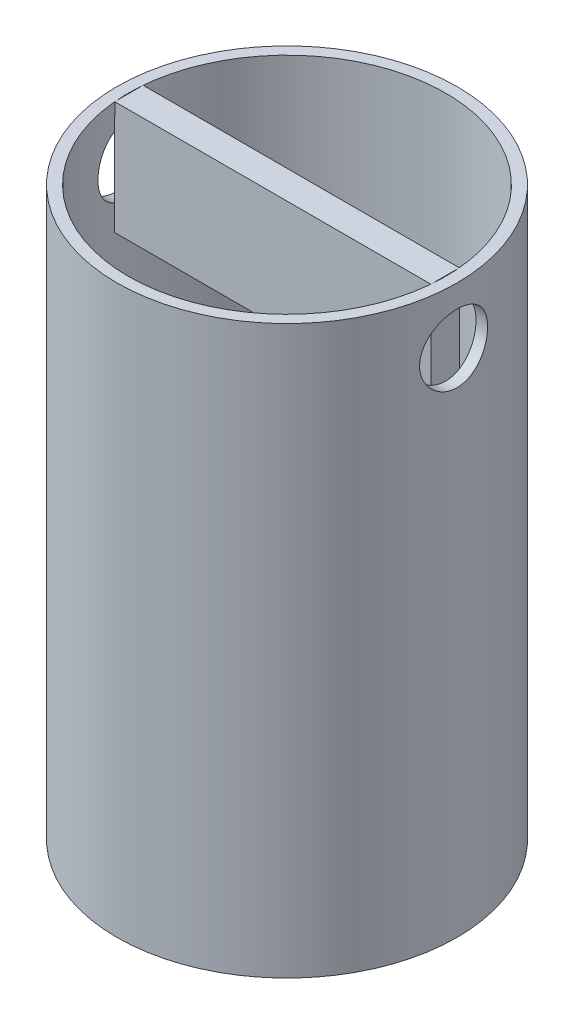
ISO-10303-21;
HEADER;
FILE_DESCRIPTION(('STEP AP214'),'2;1');
FILE_NAME('part.step','',(''),(''),'','','');
FILE_SCHEMA(('AUTOMOTIVE_DESIGN { 1 0 10303 214 1 1 1 1 }'));
ENDSEC;
DATA;
#1=APPLICATION_CONTEXT('core data for automotive mechanical design processes');
#2=APPLICATION_PROTOCOL_DEFINITION('international standard','automotive_design',2000,#1);
#3=PRODUCT_CONTEXT('',#1,'mechanical');
#4=PRODUCT('Part','Part','',(#3));
#5=PRODUCT_RELATED_PRODUCT_CATEGORY('part','',(#4));
#6=PRODUCT_DEFINITION_FORMATION('','',#4);
#7=PRODUCT_DEFINITION_CONTEXT('part definition',#1,'design');
#8=PRODUCT_DEFINITION('design','',#6,#7);
#9=PRODUCT_DEFINITION_SHAPE('','',#8);
#10=(LENGTH_UNIT() NAMED_UNIT(*) SI_UNIT(.MILLI.,.METRE.));
#11=(NAMED_UNIT(*) PLANE_ANGLE_UNIT() SI_UNIT($,.RADIAN.));
#12=(NAMED_UNIT(*) SI_UNIT($,.STERADIAN.) SOLID_ANGLE_UNIT());
#13=UNCERTAINTY_MEASURE_WITH_UNIT(LENGTH_MEASURE(1.E-05),#10,'distance_accuracy_value','');
#14=(GEOMETRIC_REPRESENTATION_CONTEXT(3) GLOBAL_UNCERTAINTY_ASSIGNED_CONTEXT((#13)) GLOBAL_UNIT_ASSIGNED_CONTEXT((#10,
#11,#12)) REPRESENTATION_CONTEXT('',''));
#15=CARTESIAN_POINT('',(0.,0.,0.));
#16=DIRECTION('',(0.,0.,1.));
#17=DIRECTION('',(1.,0.,0.));
#18=AXIS2_PLACEMENT_3D('',#15,#16,#17);
#19=CARTESIAN_POINT('',(-13.9438942457231,40.,-1.25212350193235));
#20=DIRECTION('',(-1.,0.,0.));
#21=DIRECTION('',(0.,0.,1.));
#22=AXIS2_PLACEMENT_3D('',#19,#20,#21);
#23=PLANE('',#22);
#24=DIRECTION('',(0.,0.,1.));
#25=VECTOR('',#24,1.);
#26=CARTESIAN_POINT('',(-13.9438942457231,50.,-1.25212350193235));
#27=LINE('',#26,#25);
#28=CARTESIAN_POINT('',(-13.9438942457231,50.,-1.25212350193235));
#29=VERTEX_POINT('',#28);
#30=CARTESIAN_POINT('',(-13.9438942457231,50.,1.25212350193235));
#31=VERTEX_POINT('',#30);
#32=EDGE_CURVE('E113',#29,#31,#27,.T.);
#33=ORIENTED_EDGE('',*,*,#32,.F.);
#34=DIRECTION('',(0.,1.,0.));
#35=VECTOR('',#34,1.);
#36=CARTESIAN_POINT('',(-13.9438942457231,40.,-1.25212350193235));
#37=LINE('',#36,#35);
#38=CARTESIAN_POINT('',(-13.9438942457231,40.,-1.25212350193235));
#39=VERTEX_POINT('',#38);
#40=EDGE_CURVE('E12',#39,#29,#37,.T.);
#41=ORIENTED_EDGE('',*,*,#40,.F.);
#42=DIRECTION('',(0.,0.,1.));
#43=VECTOR('',#42,1.);
#44=CARTESIAN_POINT('',(-13.9438942457231,40.,-1.25212350193235));
#45=LINE('',#44,#43);
#46=CARTESIAN_POINT('',(-13.9438942457231,40.,1.25212350193235));
#47=VERTEX_POINT('',#46);
#48=EDGE_CURVE('E107',#39,#47,#45,.T.);
#49=ORIENTED_EDGE('',*,*,#48,.T.);
#50=DIRECTION('',(0.,1.,0.));
#51=VECTOR('',#50,1.);
#52=CARTESIAN_POINT('',(-13.9438942457231,40.,1.25212350193235));
#53=LINE('',#52,#51);
#54=EDGE_CURVE('E52',#47,#31,#53,.T.);
#55=ORIENTED_EDGE('',*,*,#54,.T.);
#56=EDGE_LOOP('',(#33,#41,#49,#55));
#57=FACE_BOUND('',#56,.T.);
#58=ADVANCED_FACE('F49',(#57),#23,.T.);
#59=CARTESIAN_POINT('',(13.9438942457231,40.,-1.25212350193235));
#60=DIRECTION('',(0.,0.,-1.));
#61=DIRECTION('',(-1.,0.,0.));
#62=AXIS2_PLACEMENT_3D('',#59,#60,#61);
#63=PLANE('',#62);
#64=DIRECTION('',(-1.,0.,0.));
#65=VECTOR('',#64,1.);
#66=CARTESIAN_POINT('',(13.9438942457231,50.,-1.25212350193235));
#67=LINE('',#66,#65);
#68=CARTESIAN_POINT('',(13.9438942457231,50.,-1.25212350193235));
#69=VERTEX_POINT('',#68);
#70=EDGE_CURVE('E109',#69,#29,#67,.T.);
#71=ORIENTED_EDGE('',*,*,#70,.F.);
#72=DIRECTION('',(0.,1.,0.));
#73=VECTOR('',#72,1.);
#74=CARTESIAN_POINT('',(13.9438942457231,40.,-1.25212350193235));
#75=LINE('',#74,#73);
#76=CARTESIAN_POINT('',(13.9438942457231,40.,-1.25212350193235));
#77=VERTEX_POINT('',#76);
#78=EDGE_CURVE('E58',#77,#69,#75,.T.);
#79=ORIENTED_EDGE('',*,*,#78,.F.);
#80=DIRECTION('',(-1.,0.,0.));
#81=VECTOR('',#80,1.);
#82=CARTESIAN_POINT('',(13.9438942457231,40.,-1.25212350193235));
#83=LINE('',#82,#81);
#84=EDGE_CURVE('E104',#77,#39,#83,.T.);
#85=ORIENTED_EDGE('',*,*,#84,.T.);
#86=ORIENTED_EDGE('',*,*,#40,.T.);
#87=EDGE_LOOP('',(#71,#79,#85,#86));
#88=FACE_BOUND('',#87,.T.);
#89=ADVANCED_FACE('F123',(#88),#63,.T.);
#90=CARTESIAN_POINT('',(13.9438942457231,40.,-1.25212350193235));
#91=DIRECTION('',(1.,0.,0.));
#92=DIRECTION('',(0.,0.,-1.));
#93=AXIS2_PLACEMENT_3D('',#90,#91,#92);
#94=PLANE('',#93);
#95=DIRECTION('',(0.,0.,-1.));
#96=VECTOR('',#95,1.);
#97=CARTESIAN_POINT('',(13.9438942457231,50.,-1.25212350193235));
#98=LINE('',#97,#96);
#99=CARTESIAN_POINT('',(13.9438942457231,50.,1.25212350193235));
#100=VERTEX_POINT('',#99);
#101=EDGE_CURVE('E99',#100,#69,#98,.T.);
#102=ORIENTED_EDGE('',*,*,#101,.F.);
#103=DIRECTION('',(0.,1.,0.));
#104=VECTOR('',#103,1.);
#105=CARTESIAN_POINT('',(13.9438942457231,40.,1.25212350193235));
#106=LINE('',#105,#104);
#107=CARTESIAN_POINT('',(13.9438942457231,40.,1.25212350193235));
#108=VERTEX_POINT('',#107);
#109=EDGE_CURVE('E94',#108,#100,#106,.T.);
#110=ORIENTED_EDGE('',*,*,#109,.F.);
#111=DIRECTION('',(0.,0.,-1.));
#112=VECTOR('',#111,1.);
#113=CARTESIAN_POINT('',(13.9438942457231,40.,-1.25212350193235));
#114=LINE('',#113,#112);
#115=EDGE_CURVE('E97',#108,#77,#114,.T.);
#116=ORIENTED_EDGE('',*,*,#115,.T.);
#117=ORIENTED_EDGE('',*,*,#78,.T.);
#118=EDGE_LOOP('',(#102,#110,#116,#117));
#119=FACE_BOUND('',#118,.T.);
#120=ADVANCED_FACE('F96',(#119),#94,.T.);
#121=CARTESIAN_POINT('',(13.9438942457231,40.,1.25212350193235));
#122=DIRECTION('',(0.,0.,1.));
#123=DIRECTION('',(1.,0.,0.));
#124=AXIS2_PLACEMENT_3D('',#121,#122,#123);
#125=PLANE('',#124);
#126=DIRECTION('',(1.,0.,0.));
#127=VECTOR('',#126,1.);
#128=CARTESIAN_POINT('',(13.9438942457231,50.,1.25212350193235));
#129=LINE('',#128,#127);
#130=EDGE_CURVE('E116',#31,#100,#129,.T.);
#131=ORIENTED_EDGE('',*,*,#130,.F.);
#132=ORIENTED_EDGE('',*,*,#54,.F.);
#133=DIRECTION('',(1.,0.,0.));
#134=VECTOR('',#133,1.);
#135=CARTESIAN_POINT('',(13.9438942457231,40.,1.25212350193235));
#136=LINE('',#135,#134);
#137=EDGE_CURVE('E103',#47,#108,#136,.T.);
#138=ORIENTED_EDGE('',*,*,#137,.T.);
#139=ORIENTED_EDGE('',*,*,#109,.T.);
#140=EDGE_LOOP('',(#131,#132,#138,#139));
#141=FACE_BOUND('',#140,.T.);
#142=ADVANCED_FACE('F106',(#141),#125,.T.);
#143=CARTESIAN_POINT('',(0.,40.,0.));
#144=DIRECTION('',(0.,-1.,0.));
#145=DIRECTION('',(0.,0.,-1.));
#146=AXIS2_PLACEMENT_3D('',#143,#144,#145);
#147=PLANE('',#146);
#148=ORIENTED_EDGE('',*,*,#48,.F.);
#149=ORIENTED_EDGE('',*,*,#84,.F.);
#150=ORIENTED_EDGE('',*,*,#115,.F.);
#151=ORIENTED_EDGE('',*,*,#137,.F.);
#152=EDGE_LOOP('',(#148,#149,#150,#151));
#153=FACE_BOUND('',#152,.T.);
#154=ADVANCED_FACE('F102',(#153),#147,.T.);
#155=CARTESIAN_POINT('',(0.,50.,0.));
#156=DIRECTION('',(0.,-1.,0.));
#157=DIRECTION('',(0.,0.,-1.));
#158=AXIS2_PLACEMENT_3D('',#155,#156,#157);
#159=PLANE('',#158);
#160=ORIENTED_EDGE('',*,*,#32,.T.);
#161=ORIENTED_EDGE('',*,*,#130,.T.);
#162=ORIENTED_EDGE('',*,*,#101,.T.);
#163=ORIENTED_EDGE('',*,*,#70,.T.);
#164=EDGE_LOOP('',(#160,#161,#162,#163));
#165=FACE_BOUND('',#164,.T.);
#166=ADVANCED_FACE('F122',(#165),#159,.F.);
#167=CLOSED_SHELL('',(#58,#89,#120,#142,#154,#166));
#168=MANIFOLD_SOLID_BREP('B2',#167);
#169=CARTESIAN_POINT('',(0.,50.,0.));
#170=DIRECTION('',(0.,1.,0.));
#171=DIRECTION('',(0.,0.,1.));
#172=AXIS2_PLACEMENT_3D('',#169,#170,#171);
#173=PLANE('',#172);
#174=CARTESIAN_POINT('',(0.,50.,0.));
#175=DIRECTION('',(0.,1.,0.));
#176=DIRECTION('',(0.,0.,1.));
#177=AXIS2_PLACEMENT_3D('',#174,#175,#176);
#178=CIRCLE('',#177,15.);
#179=CARTESIAN_POINT('',(0.,50.,15.));
#180=VERTEX_POINT('',#179);
#181=EDGE_CURVE('E48',#180,#180,#178,.T.);
#182=ORIENTED_EDGE('',*,*,#181,.T.);
#183=EDGE_LOOP('',(#182));
#184=FACE_BOUND('',#183,.T.);
#185=CARTESIAN_POINT('',(0.,50.,0.));
#186=DIRECTION('',(0.,1.,0.));
#187=DIRECTION('',(0.,0.,1.));
#188=AXIS2_PLACEMENT_3D('',#185,#186,#187);
#189=CIRCLE('',#188,14.);
#190=CARTESIAN_POINT('',(0.,50.,14.));
#191=VERTEX_POINT('',#190);
#192=EDGE_CURVE('E192',#191,#191,#189,.T.);
#193=ORIENTED_EDGE('',*,*,#192,.F.);
#194=EDGE_LOOP('',(#193));
#195=FACE_BOUND('',#194,.T.);
#196=ADVANCED_FACE('F173',(#184,#195),#173,.T.);
#197=CARTESIAN_POINT('',(0.,0.,0.));
#198=DIRECTION('',(0.,1.,0.));
#199=DIRECTION('',(0.,0.,1.));
#200=AXIS2_PLACEMENT_3D('',#197,#198,#199);
#201=PLANE('',#200);
#202=CARTESIAN_POINT('',(0.,0.,0.));
#203=DIRECTION('',(0.,1.,0.));
#204=DIRECTION('',(0.,0.,1.));
#205=AXIS2_PLACEMENT_3D('',#202,#203,#204);
#206=CIRCLE('',#205,15.);
#207=CARTESIAN_POINT('',(0.,0.,15.));
#208=VERTEX_POINT('',#207);
#209=EDGE_CURVE('E187',#208,#208,#206,.T.);
#210=ORIENTED_EDGE('',*,*,#209,.F.);
#211=EDGE_LOOP('',(#210));
#212=FACE_BOUND('',#211,.T.);
#213=CARTESIAN_POINT('',(0.,0.,0.));
#214=DIRECTION('',(0.,1.,0.));
#215=DIRECTION('',(0.,0.,1.));
#216=AXIS2_PLACEMENT_3D('',#213,#214,#215);
#217=CIRCLE('',#216,14.);
#218=CARTESIAN_POINT('',(0.,0.,14.));
#219=VERTEX_POINT('',#218);
#220=EDGE_CURVE('E195',#219,#219,#217,.T.);
#221=ORIENTED_EDGE('',*,*,#220,.T.);
#222=EDGE_LOOP('',(#221));
#223=FACE_BOUND('',#222,.T.);
#224=ADVANCED_FACE('F231',(#212,#223),#201,.F.);
#225=CARTESIAN_POINT('',(0.,50.,0.));
#226=DIRECTION('',(0.,-1.,0.));
#227=DIRECTION('',(0.,0.,-1.));
#228=AXIS2_PLACEMENT_3D('',#225,#226,#227);
#229=CYLINDRICAL_SURFACE('',#228,15.);
#230=CARTESIAN_POINT('',(-15.,42.,0.));
#231=CARTESIAN_POINT('',(-14.9999969274261,42.000006133495,-0.1667307203779));
#232=CARTESIAN_POINT('',(-14.9971915553469,42.0139465289029,-0.333538980604568));
#233=CARTESIAN_POINT('',(-14.9862709686969,42.0692955003457,-0.662440523067059));
#234=CARTESIAN_POINT('',(-14.9781515358056,42.1107258984045,-0.824529952624068));
#235=CARTESIAN_POINT('',(-14.9575094783486,42.2197238208624,-1.13919091578994));
#236=CARTESIAN_POINT('',(-14.9449910723015,42.2872663105341,-1.2917714037994));
#237=CARTESIAN_POINT('',(-14.9169119410594,42.4464967425339,-1.58342396659268));
#238=CARTESIAN_POINT('',(-14.9013513970712,42.5381832468216,-1.72249684522744));
#239=CARTESIAN_POINT('',(-14.8686649598991,42.7444154828743,-1.9850804319446));
#240=CARTESIAN_POINT('',(-14.8515223651304,42.8592250661736,-2.10838185347558));
#241=CARTESIAN_POINT('',(-14.8177254135776,43.1078772491751,-2.33411026982409));
#242=CARTESIAN_POINT('',(-14.8010710950127,43.2417213340054,-2.43653563431128));
#243=CARTESIAN_POINT('',(-14.7699732543785,43.5261485790356,-2.61849526004286));
#244=CARTESIAN_POINT('',(-14.7555512209484,43.6768729313891,-2.6978128165976));
#245=CARTESIAN_POINT('',(-14.7307880417525,43.9898454570122,-2.82991699974093));
#246=CARTESIAN_POINT('',(-14.7204464928588,44.152092490039,-2.88270624731172));
#247=CARTESIAN_POINT('',(-14.7051841575661,44.4812530917238,-2.95957589965448));
#248=CARTESIAN_POINT('',(-14.7001941032156,44.6480776324267,-2.98402349387633));
#249=CARTESIAN_POINT('',(-14.6959912518188,44.983529464093,-3.00465638317836));
#250=CARTESIAN_POINT('',(-14.6967778640352,45.1521565689604,-3.0008445681405));
#251=CARTESIAN_POINT('',(-14.7039765344455,45.483740364063,-2.96536371930546));
#252=CARTESIAN_POINT('',(-14.7103035857629,45.6467442168819,-2.93411562073172));
#253=CARTESIAN_POINT('',(-14.7277363848,45.965148229989,-2.84531365386915));
#254=CARTESIAN_POINT('',(-14.7388423607334,46.120548026757,-2.78775852930205));
#255=CARTESIAN_POINT('',(-14.7646685550122,46.4205457851108,-2.64757435102416));
#256=CARTESIAN_POINT('',(-14.7794126944111,46.5650636387075,-2.56477845369634));
#257=CARTESIAN_POINT('',(-14.8108385631919,46.8383125499184,-2.37658072371804));
#258=CARTESIAN_POINT('',(-14.827520515151,46.9670417905535,-2.27117629307049));
#259=CARTESIAN_POINT('',(-14.8613106372439,47.2074882073708,-2.03849980368176));
#260=CARTESIAN_POINT('',(-14.8784210763271,47.3188577035774,-1.91086848363734));
#261=CARTESIAN_POINT('',(-14.9108654614323,47.5186615389037,-1.63855507218603));
#262=CARTESIAN_POINT('',(-14.9261993846692,47.6070955838807,-1.49387276213817));
#263=CARTESIAN_POINT('',(-14.9534007048266,47.7585825276779,-1.19117816063676));
#264=CARTESIAN_POINT('',(-14.9652626654482,47.8215956809336,-1.0331454587559));
#265=CARTESIAN_POINT('',(-14.9841422696357,47.9200814221157,-0.708446929345993));
#266=CARTESIAN_POINT('',(-14.9911605000159,47.9555573462209,-0.541782150217348));
#267=CARTESIAN_POINT('',(-14.999480156006,47.9974693613828,-0.207538216881451));
#268=CARTESIAN_POINT('',(-15.0008752395741,48.0043812586208,-0.040020984976728));
#269=CARTESIAN_POINT('',(-14.9980515579031,47.9902504231735,0.293774802578143));
#270=CARTESIAN_POINT('',(-14.9938331082434,47.9692092619422,0.460053427331381));
#271=CARTESIAN_POINT('',(-14.9803149602405,47.9001648793681,0.785116979839623));
#272=CARTESIAN_POINT('',(-14.9710612921262,47.8524057945063,0.943955845019709));
#273=CARTESIAN_POINT('',(-14.948506561831,47.7315480520326,1.251370882499));
#274=CARTESIAN_POINT('',(-14.9352051964268,47.6584474959695,1.39994628491262));
#275=CARTESIAN_POINT('',(-14.9057973459988,47.4879525280461,1.68462352105865));
#276=CARTESIAN_POINT('',(-14.8896585131116,47.3902716568832,1.82055038025657));
#277=CARTESIAN_POINT('',(-14.8564420448965,47.1737724263782,2.07425405735762));
#278=CARTESIAN_POINT('',(-14.8393643090516,47.0549518008004,2.19202892679229));
#279=CARTESIAN_POINT('',(-14.8058791067089,46.7973799443266,2.40792177232253));
#280=CARTESIAN_POINT('',(-14.7894858069991,46.658352767336,2.50571310734597));
#281=CARTESIAN_POINT('',(-14.7595257538858,46.36556591593,2.67655626015362));
#282=CARTESIAN_POINT('',(-14.7459588874003,46.2118068312793,2.74960906776871));
#283=CARTESIAN_POINT('',(-14.7233022175315,45.8946952615514,2.86845552474588));
#284=CARTESIAN_POINT('',(-14.7141892461656,45.731397476369,2.91439049937315));
#285=CARTESIAN_POINT('',(-14.7014231037608,45.3991996395273,2.97812595488159));
#286=CARTESIAN_POINT('',(-14.6977692207333,45.230300321372,2.99593010467534));
#287=CARTESIAN_POINT('',(-14.6963744889414,44.8949734063671,3.00276273260241));
#288=CARTESIAN_POINT('',(-14.698527575679,44.728556553219,2.99230736421269));
#289=CARTESIAN_POINT('',(-14.7082672045384,44.3999050502849,2.94405691230019));
#290=CARTESIAN_POINT('',(-14.7158537030151,44.2376703669156,2.9062620483879));
#291=CARTESIAN_POINT('',(-14.7355579265748,43.9223168662784,2.80463570549687));
#292=CARTESIAN_POINT('',(-14.7476646305649,43.7691769184928,2.74086752015204));
#293=CARTESIAN_POINT('',(-14.7750514492251,43.4756888377967,2.58916393380482));
#294=CARTESIAN_POINT('',(-14.7903318299668,43.3353417788246,2.50122650632465));
#295=CARTESIAN_POINT('',(-14.8226688156968,43.0688532835491,2.30191774435924));
#296=CARTESIAN_POINT('',(-14.839751187291,42.9429937041972,2.19017366170554));
#297=CARTESIAN_POINT('',(-14.8735824561586,42.7116413834125,1.94719310703942));
#298=CARTESIAN_POINT('',(-14.8903312758955,42.6061533290482,1.81595216146001));
#299=CARTESIAN_POINT('',(-14.9218149716391,42.4174960681607,1.53605288726474));
#300=CARTESIAN_POINT('',(-14.9365269365774,42.3345719901599,1.38722665328951));
#301=CARTESIAN_POINT('',(-14.96205375255,42.1950416322102,1.0774990828222));
#302=CARTESIAN_POINT('',(-14.9728721141585,42.1384116314025,0.916608782589383));
#303=CARTESIAN_POINT('',(-14.9872911778611,42.0640441558659,0.629464466771343));
#304=CARTESIAN_POINT('',(-14.9920290947535,42.0400704188767,0.504844992041358));
#305=CARTESIAN_POINT('',(-14.9983846241968,42.0080462629249,0.253498575630204));
#306=CARTESIAN_POINT('',(-15.0000023361946,41.9999953364707,0.126771701245858));
#307=CARTESIAN_POINT('',(-15.,42.,0.));
#308=B_SPLINE_CURVE_WITH_KNOTS('',3,(#230,#231,#232,#233,#234,#235,#236,#237,#238,#239,#240,
#241,#242,#243,#244,#245,#246,#247,#248,#249,#250,#251,#252,#253,#254,#255,#256,#257,#258,#259,
#260,#261,#262,#263,#264,#265,#266,#267,#268,#269,#270,#271,#272,#273,#274,#275,#276,#277,#278,
#279,#280,#281,#282,#283,#284,#285,#286,#287,#288,#289,#290,#291,#292,#293,#294,#295,#296,#297,
#298,#299,#300,#301,#302,#303,#304,#305,#306,#307),.UNSPECIFIED.,.T.,.F.,(4,2,2,2,2,2,2,2,2,2,2,
2,2,2,2,2,2,2,2,2,2,2,2,2,2,2,2,2,2,2,2,2,2,2,2,2,2,2,4),(0.,0.499728391983776,
0.999853952073971,1.49950120575103,1.99911870669259,2.50479801033657,3.0105167902421,
3.52083585017768,4.03110448095593,4.53468555310762,5.03821512843676,5.53415181018835,
6.0301121776119,6.52942470610779,7.02879464249012,7.53714757474052,8.04550702619462,
8.55465824562073,9.06374777094109,9.56432207028796,10.064868229736,10.5609136185217,
11.0569961764807,11.5591519810008,12.0613616503779,12.5712188573768,13.081055661704,
13.5882114309817,14.0953010499125,14.593191677031,15.0910783047783,15.5877588375933,
16.084481027456,16.5896422871743,17.0949196359879,17.6054849002691,18.1155886655256,
18.4955632586968,18.8755257411299),.UNSPECIFIED.);
#309=CARTESIAN_POINT('',(-15.,42.,0.));
#310=VERTEX_POINT('',#309);
#311=EDGE_CURVE('E220',#310,#310,#308,.T.);
#312=ORIENTED_EDGE('',*,*,#311,.T.);
#313=EDGE_LOOP('',(#312));
#314=FACE_BOUND('',#313,.T.);
#315=CARTESIAN_POINT('',(14.6969384566991,45.,-3.));
#316=CARTESIAN_POINT('',(14.6969417707994,44.8333068735265,-2.99999383762582));
#317=CARTESIAN_POINT('',(14.6998052480611,44.66653613,-2.98605951515444));
#318=CARTESIAN_POINT('',(14.7109329391462,44.3377124845706,-2.93073685074853));
#319=CARTESIAN_POINT('',(14.7192014743436,44.1756634660921,-2.88932654121148));
#320=CARTESIAN_POINT('',(14.7401662116556,43.8610880899374,-2.78038734785924));
#321=CARTESIAN_POINT('',(14.7528580086323,43.7085524354022,-2.71288444245786));
#322=CARTESIAN_POINT('',(14.7812339844198,43.4169754659091,-2.55374732301151));
#323=CARTESIAN_POINT('',(14.7969179962038,43.2779333983863,-2.46211445580345));
#324=CARTESIAN_POINT('',(14.8297589908276,43.0153169884384,-2.25593722696031));
#325=CARTESIAN_POINT('',(14.8469321351174,42.8919612363481,-2.14111696773995));
#326=CARTESIAN_POINT('',(14.880674169078,42.6661273992631,-1.89242036706393));
#327=CARTESIAN_POINT('',(14.8972430163249,42.5636507777484,-1.75854269093395));
#328=CARTESIAN_POINT('',(14.9280838925269,42.3816359471146,-1.47408406777277));
#329=CARTESIAN_POINT('',(14.9423346432465,42.3023054585501,-1.32336770301663));
#330=CARTESIAN_POINT('',(14.9667521065089,42.1701751888556,-1.01041245116181));
#331=CARTESIAN_POINT('',(14.9769192013236,42.117372924297,-0.848174644261657));
#332=CARTESIAN_POINT('',(14.9919096206526,42.0404784191411,-0.519050319835482));
#333=CARTESIAN_POINT('',(14.9968015886438,42.016017067287,-0.352253217644441));
#334=CARTESIAN_POINT('',(15.0009276355081,41.9953471444851,-0.0168557053126072));
#335=CARTESIAN_POINT('',(15.0001622595828,41.9991358510625,0.151744529495531));
#336=CARTESIAN_POINT('',(14.9931130460555,42.0345785406467,0.483426002230767));
#337=CARTESIAN_POINT('',(14.9869079509751,42.0658349315035,0.646551642895412));
#338=CARTESIAN_POINT('',(14.9697653147823,42.1546950973767,0.965194879740905));
#339=CARTESIAN_POINT('',(14.9588275843212,42.2122999265756,1.12071217124139));
#340=CARTESIAN_POINT('',(14.9333188805988,42.3525901204418,1.42085838960266));
#341=CARTESIAN_POINT('',(14.9187254452567,42.4354312533147,1.5654125224017));
#342=CARTESIAN_POINT('',(14.8875140842136,42.6237272317098,1.83871513757927));
#343=CARTESIAN_POINT('',(14.8708959256567,42.7291846793116,1.967461798575));
#344=CARTESIAN_POINT('',(14.8371289309338,42.9619008663254,2.20785429316037));
#345=CARTESIAN_POINT('',(14.8199758937255,43.0895075601888,2.3191629497209));
#346=CARTESIAN_POINT('',(14.7873471479628,43.3617493273523,2.51885547953042));
#347=CARTESIAN_POINT('',(14.7718714711364,43.5063847226496,2.60723891918325));
#348=CARTESIAN_POINT('',(14.7443414241877,43.8090624954654,2.75868844440565));
#349=CARTESIAN_POINT('',(14.7322944469065,43.967132902919,2.82169994333313));
#350=CARTESIAN_POINT('',(14.7130942896382,44.291913971172,2.92017102488275));
#351=CARTESIAN_POINT('',(14.7059404718528,44.4586235028573,2.95563419836993));
#352=CARTESIAN_POINT('',(14.6974643780348,44.7928945739971,2.99749801810816));
#353=CARTESIAN_POINT('',(14.6960444117146,44.960392722931,3.00438557669374));
#354=CARTESIAN_POINT('',(14.6989345706656,45.294144669599,2.99021288493222));
#355=CARTESIAN_POINT('',(14.7032443710116,45.4603985373566,2.96915421936733));
#356=CARTESIAN_POINT('',(14.7170169748474,45.7853059208767,2.90010662422247));
#357=CARTESIAN_POINT('',(14.7264299704349,45.9440170291073,2.8523778625179));
#358=CARTESIAN_POINT('',(14.7493046805499,46.2511898370862,2.73162310592556));
#359=CARTESIAN_POINT('',(14.7627667285881,46.3996506913072,2.65859502711953));
#360=CARTESIAN_POINT('',(14.7924421788612,46.6842393298505,2.48821242664679));
#361=CARTESIAN_POINT('',(14.8086891559471,46.8201811389025,2.39055323394826));
#362=CARTESIAN_POINT('',(14.8420117147991,47.0739249360027,2.17408671663814));
#363=CARTESIAN_POINT('',(14.8590873817145,47.1917250547478,2.05527721543361));
#364=CARTESIAN_POINT('',(14.8924603760765,47.4076876775567,1.79769682049367));
#365=CARTESIAN_POINT('',(14.9087417312605,47.50552096395,1.65864749678889));
#366=CARTESIAN_POINT('',(14.9384138288586,47.6764376444988,1.36580368990426));
#367=CARTESIAN_POINT('',(14.9518046926563,47.7495220780343,1.21200982630052));
#368=CARTESIAN_POINT('',(14.974118821832,47.8683866152399,0.894908042472037));
#369=CARTESIAN_POINT('',(14.9830673742781,47.9143215546788,0.731660020434235));
#370=CARTESIAN_POINT('',(14.9955970781298,47.9780737429915,0.399568364039736));
#371=CARTESIAN_POINT('',(14.9991788759955,47.995894378427,0.230725406133636));
#372=CARTESIAN_POINT('',(15.0005562136234,48.0027809428887,-0.104618681710863));
#373=CARTESIAN_POINT('',(14.9984513564799,47.9923418413687,-0.271109436424482));
#374=CARTESIAN_POINT('',(14.9889013068102,47.9440981483565,-0.599913093946951));
#375=CARTESIAN_POINT('',(14.9814561814329,47.9062939009556,-0.762226049261169));
#376=CARTESIAN_POINT('',(14.9620649509476,47.8046130237252,-1.0777582492352));
#377=CARTESIAN_POINT('',(14.9501291174284,47.7407958656071,-1.23099732972049));
#378=CARTESIAN_POINT('',(14.9230416637104,47.5889632760067,-1.52466366055821));
#379=CARTESIAN_POINT('',(14.9078897894096,47.5009459322865,-1.66508989730354));
#380=CARTESIAN_POINT('',(14.8757279747022,47.3015418388161,-1.93159167031775));
#381=CARTESIAN_POINT('',(14.858692002537,47.1898009908487,-2.05739914834453));
#382=CARTESIAN_POINT('',(14.8248366872359,46.9468492797037,-2.28864785327552));
#383=CARTESIAN_POINT('',(14.8080173963616,46.8156338115602,-2.39408424962674));
#384=CARTESIAN_POINT('',(14.7763002820179,46.5357620499287,-2.58267665834995));
#385=CARTESIAN_POINT('',(14.7614251071368,46.3869331166362,-2.66558044385427));
#386=CARTESIAN_POINT('',(14.7355571137924,46.0772016802197,-2.80507214779868));
#387=CARTESIAN_POINT('',(14.7245607757495,45.9163102839384,-2.86168393792249));
#388=CARTESIAN_POINT('',(14.7098904341354,45.6292126336714,-2.93600741957297));
#389=CARTESIAN_POINT('',(14.7050635474382,45.5046437414581,-2.95996169557106));
#390=CARTESIAN_POINT('',(14.6985863537725,45.2533981363466,-2.99196005387914));
#391=CARTESIAN_POINT('',(14.6969359372925,45.1267214962666,-3.00000468468793));
#392=CARTESIAN_POINT('',(14.6969384566991,45.,-3.));
#393=B_SPLINE_CURVE_WITH_KNOTS('',3,(#315,#316,#317,#318,#319,#320,#321,#322,#323,#324,#325,
#326,#327,#328,#329,#330,#331,#332,#333,#334,#335,#336,#337,#338,#339,#340,#341,#342,#343,#344,
#345,#346,#347,#348,#349,#350,#351,#352,#353,#354,#355,#356,#357,#358,#359,#360,#361,#362,#363,
#364,#365,#366,#367,#368,#369,#370,#371,#372,#373,#374,#375,#376,#377,#378,#379,#380,#381,#382,
#383,#384,#385,#386,#387,#388,#389,#390,#391,#392),.UNSPECIFIED.,.T.,.F.,(4,2,2,2,2,2,2,2,2,2,2,
2,2,2,2,2,2,2,2,2,2,2,2,2,2,2,2,2,2,2,2,2,2,2,2,2,2,2,4),(0.,0.499615391608283,
0.999630717852891,1.49914949382176,1.99864039457959,2.5044675764531,3.01033020106266,
3.52060201312351,4.0308260473968,4.53432746649242,5.03778036348745,5.53406368900613,
6.03036687221251,6.5297977266691,7.02928607310199,7.5374804028745,8.04568434368162,
8.55497589518331,9.06420105048075,9.56471273413781,10.0651960358526,10.5608802534996,
11.056605310632,11.5587917932356,12.0610299861063,12.5709780520035,13.0809046989032,
13.5878944073595,14.0948230407488,14.5929305224406,15.0910317410027,15.5880005122636,
16.0850085640405,16.5900345607679,17.0951801666934,17.6057669573882,18.115889252706,
18.4957141091449,18.8755258705644),.UNSPECIFIED.);
#394=CARTESIAN_POINT('',(14.6969384566991,45.,-3.));
#395=VERTEX_POINT('',#394);
#396=EDGE_CURVE('E215',#395,#395,#393,.T.);
#397=ORIENTED_EDGE('',*,*,#396,.T.);
#398=EDGE_LOOP('',(#397));
#399=FACE_BOUND('',#398,.T.);
#400=ORIENTED_EDGE('',*,*,#181,.F.);
#401=EDGE_LOOP('',(#400));
#402=FACE_BOUND('',#401,.T.);
#403=ORIENTED_EDGE('',*,*,#209,.T.);
#404=EDGE_LOOP('',(#403));
#405=FACE_BOUND('',#404,.T.);
#406=ADVANCED_FACE('F175',(#314,#399,#402,#405),#229,.T.);
#407=CARTESIAN_POINT('',(0.,50.,0.));
#408=DIRECTION('',(0.,-1.,0.));
#409=DIRECTION('',(0.,0.,-1.));
#410=AXIS2_PLACEMENT_3D('',#407,#408,#409);
#411=CYLINDRICAL_SURFACE('',#410,14.);
#412=CARTESIAN_POINT('',(-13.6747943311773,45.,-3.));
#413=CARTESIAN_POINT('',(-13.6747976912119,45.166422304966,-2.99999416477353));
#414=CARTESIAN_POINT('',(-13.6778654468474,45.3329155478848,-2.9861047248957));
#415=CARTESIAN_POINT('',(-13.6897835685885,45.6611733444834,-2.93097118505965));
#416=CARTESIAN_POINT('',(-13.6986382242345,45.8229342973523,-2.88970679307235));
#417=CARTESIAN_POINT('',(-13.7210823058705,46.1369314991486,-2.78117727369208));
#418=CARTESIAN_POINT('',(-13.7346666545171,46.289177756243,-2.71394001982631));
#419=CARTESIAN_POINT('',(-13.7650334169723,46.5802305478892,-2.55545235346679));
#420=CARTESIAN_POINT('',(-13.7818157375507,46.7190374740581,-2.46420264097551));
#421=CARTESIAN_POINT('',(-13.8169915759332,46.9815259229643,-2.25870285140442));
#422=CARTESIAN_POINT('',(-13.8354049974351,47.1049577524799,-2.14413718967966));
#423=CARTESIAN_POINT('',(-13.8715938342079,47.3310071088116,-1.89593901625916));
#424=CARTESIAN_POINT('',(-13.8893692010283,47.4336230577201,-1.76230506043536));
#425=CARTESIAN_POINT('',(-13.9224953821886,47.6161108889829,-1.47809457692917));
#426=CARTESIAN_POINT('',(-13.9378199763886,47.6957433115412,-1.32736097645991));
#427=CARTESIAN_POINT('',(-13.9640934208587,47.8284553828926,-1.01426853868519));
#428=CARTESIAN_POINT('',(-13.9750427420666,47.8815378895726,-0.851910954760626));
#429=CARTESIAN_POINT('',(-13.9911913056236,47.9588599418627,-0.522774375343024));
#430=CARTESIAN_POINT('',(-13.9964746675677,47.9835218571049,-0.356098801193847));
#431=CARTESIAN_POINT('',(-14.00098724414,48.0046225546265,-0.0208978906132893));
#432=CARTESIAN_POINT('',(-14.000217124654,48.0010644411215,0.147627240329518));
#433=CARTESIAN_POINT('',(-13.9927740172512,47.9661420706728,0.478834058501024));
#434=CARTESIAN_POINT('',(-13.9861976630486,47.9352329994202,0.641566230724226));
#435=CARTESIAN_POINT('',(-13.9679908317821,47.8472106362963,0.959478927956778));
#436=CARTESIAN_POINT('',(-13.9563601323304,47.7900961914005,1.11465912035011));
#437=CARTESIAN_POINT('',(-13.9291950929372,47.650877082223,1.4143349951131));
#438=CARTESIAN_POINT('',(-13.9136337160789,47.5685984655913,1.55874731403158));
#439=CARTESIAN_POINT('',(-13.8803158748773,47.3815160636728,1.83188185312569));
#440=CARTESIAN_POINT('',(-13.8625591228939,47.2767093253994,1.96060201290306));
#441=CARTESIAN_POINT('',(-13.8263865292185,47.0450629109443,2.20140417600396));
#442=CARTESIAN_POINT('',(-13.8079646074571,46.9178248412859,2.31310234640501));
#443=CARTESIAN_POINT('',(-13.7728713366395,46.646233429863,2.51364486469456));
#444=CARTESIAN_POINT('',(-13.7562000312677,46.5018796611895,2.60248864236137));
#445=CARTESIAN_POINT('',(-13.7264804717345,46.1995509978725,2.75496155146593));
#446=CARTESIAN_POINT('',(-13.7134423025555,46.0415397522951,2.81852070177846));
#447=CARTESIAN_POINT('',(-13.6926068161323,45.7167344681071,2.91806990318231));
#448=CARTESIAN_POINT('',(-13.6848087043697,45.5499417651136,2.95406413389256));
#449=CARTESIAN_POINT('',(-13.6754976251089,45.2158084947006,2.99687172049304));
#450=CARTESIAN_POINT('',(-13.673864541034,45.0485426498454,3.00424283857281));
#451=CARTESIAN_POINT('',(-13.6767447914799,44.7151720136366,2.99110279284747));
#452=CARTESIAN_POINT('',(-13.6812577220213,44.5490671466929,2.9705934616327));
#453=CARTESIAN_POINT('',(-13.6958083096841,44.2246591300385,2.90275789271169));
#454=CARTESIAN_POINT('',(-13.7057831054873,44.0662891348061,2.85573660503107));
#455=CARTESIAN_POINT('',(-13.7300771973955,43.7596753249342,2.73654105893499));
#456=CARTESIAN_POINT('',(-13.744396895457,43.6114324487316,2.66436447325636));
#457=CARTESIAN_POINT('',(-13.7760326816069,43.3268606304822,2.4956700883341));
#458=CARTESIAN_POINT('',(-13.7933900349263,43.1907408359756,2.39880737181585));
#459=CARTESIAN_POINT('',(-13.8290355072028,42.9364833082524,2.18394367667202));
#460=CARTESIAN_POINT('',(-13.8473237366892,42.8183477171031,2.06594018364322));
#461=CARTESIAN_POINT('',(-13.8831647998035,42.6012593941105,1.80962552884163));
#462=CARTESIAN_POINT('',(-13.9006987121549,42.502686167686,1.67098985165754));
#463=CARTESIAN_POINT('',(-13.932712214298,42.3302291812979,1.37880296256455));
#464=CARTESIAN_POINT('',(-13.9471919435339,42.2563442940543,1.22525243208748));
#465=CARTESIAN_POINT('',(-13.9713855676315,42.135895890723,0.908530837964083));
#466=CARTESIAN_POINT('',(-13.9811288760739,42.0891633925074,0.74542638615035));
#467=CARTESIAN_POINT('',(-13.9948787860397,42.0238165885354,0.41345035400658));
#468=CARTESIAN_POINT('',(-13.9988861862461,42.0051983680522,0.24457957994798));
#469=CARTESIAN_POINT('',(-14.000690220181,41.9967786951763,-0.0905274341056502));
#470=CARTESIAN_POINT('',(-13.9986091800327,42.0064096827907,-0.25674901101843));
#471=CARTESIAN_POINT('',(-13.9887310472683,42.0529495270381,-0.58514587683195));
#472=CARTESIAN_POINT('',(-13.9809340494761,42.0898579311568,-0.747321232810676));
#473=CARTESIAN_POINT('',(-13.9605077727683,42.1896376124988,-1.06260389697443));
#474=CARTESIAN_POINT('',(-13.9478929286009,42.2524313787704,-1.21573673014596));
#475=CARTESIAN_POINT('',(-13.9191807210222,42.4021225423389,-1.50936991344683));
#476=CARTESIAN_POINT('',(-13.9030830344402,42.4890221766146,-1.64986908959375));
#477=CARTESIAN_POINT('',(-13.8687961986559,42.6863246374827,-1.917024613789));
#478=CARTESIAN_POINT('',(-13.8505741780296,42.7971283166328,-2.04338073020593));
#479=CARTESIAN_POINT('',(-13.8142738016446,43.0382812205105,-2.27590002915847));
#480=CARTESIAN_POINT('',(-13.7961954813912,43.1686351267478,-2.38205836126942));
#481=CARTESIAN_POINT('',(-13.761973872554,43.4471809863392,-2.57246523191562));
#482=CARTESIAN_POINT('',(-13.7458581173137,43.5955787164454,-2.65641795611844));
#483=CARTESIAN_POINT('',(-13.7177299427787,43.9046874417168,-2.79806009312271));
#484=CARTESIAN_POINT('',(-13.7057139912142,44.0653876904718,-2.8557721284606));
#485=CARTESIAN_POINT('',(-13.6894112131582,44.3552522623923,-2.93277214244342));
#486=CARTESIAN_POINT('',(-13.683965661845,44.4828233514212,-2.95793505015818));
#487=CARTESIAN_POINT('',(-13.6766559900021,44.7402486231491,-2.99155088086543));
#488=CARTESIAN_POINT('',(-13.6747917085757,44.870102703015,-3.00000455455864));
#489=CARTESIAN_POINT('',(-13.6747943311773,45.,-3.));
#490=B_SPLINE_CURVE_WITH_KNOTS('',3,(#412,#413,#414,#415,#416,#417,#418,#419,#420,#421,#422,
#423,#424,#425,#426,#427,#428,#429,#430,#431,#432,#433,#434,#435,#436,#437,#438,#439,#440,#441,
#442,#443,#444,#445,#446,#447,#448,#449,#450,#451,#452,#453,#454,#455,#456,#457,#458,#459,#460,
#461,#462,#463,#464,#465,#466,#467,#468,#469,#470,#471,#472,#473,#474,#475,#476,#477,#478,#479,
#480,#481,#482,#483,#484,#485,#486,#487,#488,#489),.UNSPECIFIED.,.T.,.F.,(4,2,2,2,2,2,2,2,2,2,2,
2,2,2,2,2,2,2,2,2,2,2,2,2,2,2,2,2,2,2,2,2,2,2,2,2,2,2,4),(0.,0.498790964055061,
0.997952076959928,1.49657898230552,1.99519135347057,2.50106459165384,3.00697616225757,
3.51798269640556,4.02893421292535,4.53219016303858,5.03539075554482,5.53037115334743,
6.02537333215168,6.52387776286874,7.0224475774463,7.5309792155859,8.03952354046184,
8.54946574823563,9.05933061907678,9.55920866385047,10.0590538530783,10.5532636149875,
11.047519111263,11.5491002043264,12.0507409931816,12.5613242936642,13.0718842775108,
13.5792317964875,14.0865086641708,14.5836639928825,15.080811074302,15.5764801923897,
16.0721953230273,16.5769782832193,17.0818823126247,17.593207603363,18.1040912322742,
18.4934291224859,18.8827495204009),.UNSPECIFIED.);
#491=CARTESIAN_POINT('',(-13.6747943311773,45.,-3.));
#492=VERTEX_POINT('',#491);
#493=EDGE_CURVE('E178',#492,#492,#490,.T.);
#494=ORIENTED_EDGE('',*,*,#493,.F.);
#495=EDGE_LOOP('',(#494));
#496=FACE_BOUND('',#495,.T.);
#497=ORIENTED_EDGE('',*,*,#192,.T.);
#498=EDGE_LOOP('',(#497));
#499=FACE_BOUND('',#498,.T.);
#500=CARTESIAN_POINT('',(13.6747943311773,45.,-3.));
#501=CARTESIAN_POINT('',(13.6747976912119,44.833577695034,-2.99999416477353));
#502=CARTESIAN_POINT('',(13.6778654468474,44.6670844521152,-2.9861047248957));
#503=CARTESIAN_POINT('',(13.6897835685885,44.3388266555166,-2.93097118505965));
#504=CARTESIAN_POINT('',(13.6986382242345,44.1770657026477,-2.88970679307235));
#505=CARTESIAN_POINT('',(13.7210823058705,43.8630685008514,-2.78117727369208));
#506=CARTESIAN_POINT('',(13.7346666545171,43.710822243757,-2.71394001982631));
#507=CARTESIAN_POINT('',(13.7650334169723,43.4197694521108,-2.55545235346679));
#508=CARTESIAN_POINT('',(13.7818157375507,43.2809625259419,-2.46420264097551));
#509=CARTESIAN_POINT('',(13.8169915759332,43.0184740770357,-2.25870285140442));
#510=CARTESIAN_POINT('',(13.8354049974351,42.8950422475201,-2.14413718967966));
#511=CARTESIAN_POINT('',(13.8715938342079,42.6689928911884,-1.89593901625916));
#512=CARTESIAN_POINT('',(13.8893692010283,42.5663769422799,-1.76230506043536));
#513=CARTESIAN_POINT('',(13.9224953821886,42.3838891110171,-1.47809457692917));
#514=CARTESIAN_POINT('',(13.9378199763886,42.3042566884588,-1.32736097645991));
#515=CARTESIAN_POINT('',(13.9640934208587,42.1715446171074,-1.01426853868519));
#516=CARTESIAN_POINT('',(13.9750427420666,42.1184621104274,-0.851910954760625));
#517=CARTESIAN_POINT('',(13.9911913056236,42.0411400581373,-0.522774375343024));
#518=CARTESIAN_POINT('',(13.9964746675677,42.0164781428951,-0.356098801193847));
#519=CARTESIAN_POINT('',(14.00098724414,41.9953774453735,-0.0208978906132896));
#520=CARTESIAN_POINT('',(14.000217124654,41.9989355588785,0.147627240329518));
#521=CARTESIAN_POINT('',(13.9927740172512,42.0338579293272,0.478834058501023));
#522=CARTESIAN_POINT('',(13.9861976630486,42.0647670005798,0.641566230724224));
#523=CARTESIAN_POINT('',(13.9679908317821,42.1527893637037,0.959478927956778));
#524=CARTESIAN_POINT('',(13.9563601323304,42.2099038085995,1.11465912035011));
#525=CARTESIAN_POINT('',(13.9291950929372,42.349122917777,1.41433499511311));
#526=CARTESIAN_POINT('',(13.9136337160789,42.4314015344087,1.55874731403158));
#527=CARTESIAN_POINT('',(13.8803158748773,42.6184839363272,1.83188185312569));
#528=CARTESIAN_POINT('',(13.8625591228939,42.7232906746006,1.96060201290306));
#529=CARTESIAN_POINT('',(13.8263865292185,42.9549370890557,2.20140417600396));
#530=CARTESIAN_POINT('',(13.8079646074571,43.0821751587141,2.31310234640501));
#531=CARTESIAN_POINT('',(13.7728713366395,43.353766570137,2.51364486469456));
#532=CARTESIAN_POINT('',(13.7562000312677,43.4981203388105,2.60248864236137));
#533=CARTESIAN_POINT('',(13.7264804717345,43.8004490021275,2.75496155146593));
#534=CARTESIAN_POINT('',(13.7134423025555,43.9584602477049,2.81852070177846));
#535=CARTESIAN_POINT('',(13.6926068161323,44.2832655318929,2.91806990318231));
#536=CARTESIAN_POINT('',(13.6848087043697,44.4500582348864,2.95406413389256));
#537=CARTESIAN_POINT('',(13.6754976251089,44.7841915052994,2.99687172049304));
#538=CARTESIAN_POINT('',(13.673864541034,44.9514573501546,3.00424283857281));
#539=CARTESIAN_POINT('',(13.6767447914799,45.2848279863634,2.99110279284747));
#540=CARTESIAN_POINT('',(13.6812577220213,45.4509328533071,2.9705934616327));
#541=CARTESIAN_POINT('',(13.6958083096841,45.7753408699615,2.90275789271169));
#542=CARTESIAN_POINT('',(13.7057831054873,45.9337108651939,2.85573660503107));
#543=CARTESIAN_POINT('',(13.7300771973955,46.2403246750658,2.73654105893499));
#544=CARTESIAN_POINT('',(13.744396895457,46.3885675512684,2.66436447325637));
#545=CARTESIAN_POINT('',(13.7760326816069,46.6731393695178,2.4956700883341));
#546=CARTESIAN_POINT('',(13.7933900349263,46.8092591640244,2.39880737181584));
#547=CARTESIAN_POINT('',(13.8290355072028,47.0635166917476,2.18394367667201));
#548=CARTESIAN_POINT('',(13.8473237366892,47.1816522828969,2.06594018364322));
#549=CARTESIAN_POINT('',(13.8831647998035,47.3987406058895,1.80962552884163));
#550=CARTESIAN_POINT('',(13.9006987121549,47.497313832314,1.67098985165754));
#551=CARTESIAN_POINT('',(13.932712214298,47.6697708187021,1.37880296256455));
#552=CARTESIAN_POINT('',(13.9471919435339,47.7436557059457,1.22525243208748));
#553=CARTESIAN_POINT('',(13.9713855676315,47.864104109277,0.908530837964083));
#554=CARTESIAN_POINT('',(13.9811288760739,47.9108366074926,0.745426386150349));
#555=CARTESIAN_POINT('',(13.9948787860397,47.9761834114646,0.413450354006579));
#556=CARTESIAN_POINT('',(13.9988861862461,47.9948016319478,0.24457957994798));
#557=CARTESIAN_POINT('',(14.000690220181,48.0032213048237,-0.0905274341056501));
#558=CARTESIAN_POINT('',(13.9986091800327,47.9935903172093,-0.25674901101843));
#559=CARTESIAN_POINT('',(13.9887310472683,47.9470504729619,-0.58514587683195));
#560=CARTESIAN_POINT('',(13.9809340494761,47.9101420688432,-0.747321232810676));
#561=CARTESIAN_POINT('',(13.9605077727683,47.8103623875012,-1.06260389697443));
#562=CARTESIAN_POINT('',(13.9478929286009,47.7475686212296,-1.21573673014596));
#563=CARTESIAN_POINT('',(13.9191807210222,47.5978774576611,-1.50936991344683));
#564=CARTESIAN_POINT('',(13.9030830344402,47.5109778233854,-1.64986908959375));
#565=CARTESIAN_POINT('',(13.8687961986559,47.3136753625173,-1.917024613789));
#566=CARTESIAN_POINT('',(13.8505741780296,47.2028716833672,-2.04338073020593));
#567=CARTESIAN_POINT('',(13.8142738016446,46.9617187794895,-2.27590002915847));
#568=CARTESIAN_POINT('',(13.7961954813912,46.8313648732522,-2.38205836126942));
#569=CARTESIAN_POINT('',(13.761973872554,46.5528190136608,-2.57246523191562));
#570=CARTESIAN_POINT('',(13.7458581173137,46.4044212835546,-2.65641795611844));
#571=CARTESIAN_POINT('',(13.7177299427787,46.0953125582832,-2.79806009312271));
#572=CARTESIAN_POINT('',(13.7057139912142,45.9346123095282,-2.8557721284606));
#573=CARTESIAN_POINT('',(13.6894112131582,45.6447477376077,-2.93277214244342));
#574=CARTESIAN_POINT('',(13.683965661845,45.5171766485788,-2.95793505015818));
#575=CARTESIAN_POINT('',(13.6766559900021,45.2597513768509,-2.99155088086543));
#576=CARTESIAN_POINT('',(13.6747917085757,45.129897296985,-3.00000455455864));
#577=CARTESIAN_POINT('',(13.6747943311773,45.,-3.));
#578=B_SPLINE_CURVE_WITH_KNOTS('',3,(#500,#501,#502,#503,#504,#505,#506,#507,#508,#509,#510,
#511,#512,#513,#514,#515,#516,#517,#518,#519,#520,#521,#522,#523,#524,#525,#526,#527,#528,#529,
#530,#531,#532,#533,#534,#535,#536,#537,#538,#539,#540,#541,#542,#543,#544,#545,#546,#547,#548,
#549,#550,#551,#552,#553,#554,#555,#556,#557,#558,#559,#560,#561,#562,#563,#564,#565,#566,#567,
#568,#569,#570,#571,#572,#573,#574,#575,#576,#577),.UNSPECIFIED.,.T.,.F.,(4,2,2,2,2,2,2,2,2,2,2,
2,2,2,2,2,2,2,2,2,2,2,2,2,2,2,2,2,2,2,2,2,2,2,2,2,2,2,4),(0.,0.498790964055054,
0.997952076959928,1.49657898230552,1.99519135347057,2.50106459165384,3.00697616225757,
3.51798269640557,4.02893421292535,4.53219016303857,5.03539075554482,5.53037115334743,
6.02537333215168,6.52387776286874,7.02244757744629,7.5309792155859,8.03952354046184,
8.54946574823562,9.05933061907678,9.55920866385046,10.0590538530783,10.5532636149875,
11.047519111263,11.5491002043264,12.0507409931816,12.5613242936642,13.0718842775108,
13.5792317964875,14.0865086641708,14.5836639928825,15.080811074302,15.5764801923897,
16.0721953230273,16.5769782832193,17.0818823126247,17.593207603363,18.1040912322742,
18.4934291224859,18.8827495204009),.UNSPECIFIED.);
#579=CARTESIAN_POINT('',(13.6747943311773,45.,-3.));
#580=VERTEX_POINT('',#579);
#581=EDGE_CURVE('E197',#580,#580,#578,.T.);
#582=ORIENTED_EDGE('',*,*,#581,.F.);
#583=EDGE_LOOP('',(#582));
#584=FACE_BOUND('',#583,.T.);
#585=ORIENTED_EDGE('',*,*,#220,.F.);
#586=EDGE_LOOP('',(#585));
#587=FACE_BOUND('',#586,.T.);
#588=ADVANCED_FACE('F202',(#496,#499,#584,#587),#411,.F.);
#589=CARTESIAN_POINT('',(-15.,45.,0.));
#590=DIRECTION('',(1.,0.,0.));
#591=DIRECTION('',(0.,0.,-1.));
#592=AXIS2_PLACEMENT_3D('',#589,#590,#591);
#593=CYLINDRICAL_SURFACE('',#592,3.);
#594=ORIENTED_EDGE('',*,*,#581,.T.);
#595=EDGE_LOOP('',(#594));
#596=FACE_BOUND('',#595,.T.);
#597=ORIENTED_EDGE('',*,*,#396,.F.);
#598=EDGE_LOOP('',(#597));
#599=FACE_BOUND('',#598,.T.);
#600=ADVANCED_FACE('F208',(#596,#599),#593,.F.);
#601=ORIENTED_EDGE('',*,*,#493,.T.);
#602=EDGE_LOOP('',(#601));
#603=FACE_BOUND('',#602,.T.);
#604=ORIENTED_EDGE('',*,*,#311,.F.);
#605=EDGE_LOOP('',(#604));
#606=FACE_BOUND('',#605,.T.);
#607=ADVANCED_FACE('F205',(#603,#606),#593,.F.);
#608=CLOSED_SHELL('',(#196,#224,#406,#588,#600,#607));
#609=MANIFOLD_SOLID_BREP('B6',#608);
#610=ADVANCED_BREP_SHAPE_REPRESENTATION('',(#18,#168,#609),#14);
#611=SHAPE_DEFINITION_REPRESENTATION(#9,#610);
ENDSEC;
END-ISO-10303-21;
